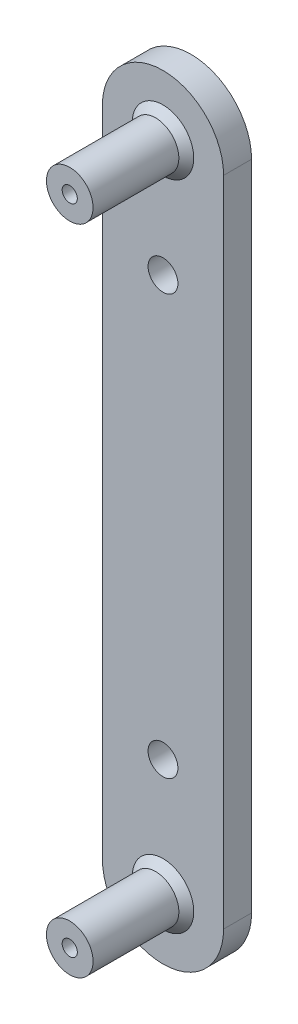
ISO-10303-21;
HEADER;
FILE_DESCRIPTION(('STEP AP214'),'2;1');
FILE_NAME('part.step','',(''),(''),'','','');
FILE_SCHEMA(('AUTOMOTIVE_DESIGN { 1 0 10303 214 1 1 1 1 }'));
ENDSEC;
DATA;
#1=APPLICATION_CONTEXT('core data for automotive mechanical design processes');
#2=APPLICATION_PROTOCOL_DEFINITION('international standard','automotive_design',2000,#1);
#3=PRODUCT_CONTEXT('',#1,'mechanical');
#4=PRODUCT('Part','Part','',(#3));
#5=PRODUCT_RELATED_PRODUCT_CATEGORY('part','',(#4));
#6=PRODUCT_DEFINITION_FORMATION('','',#4);
#7=PRODUCT_DEFINITION_CONTEXT('part definition',#1,'design');
#8=PRODUCT_DEFINITION('design','',#6,#7);
#9=PRODUCT_DEFINITION_SHAPE('','',#8);
#10=(LENGTH_UNIT() NAMED_UNIT(*) SI_UNIT(.MILLI.,.METRE.));
#11=(NAMED_UNIT(*) PLANE_ANGLE_UNIT() SI_UNIT($,.RADIAN.));
#12=(NAMED_UNIT(*) SI_UNIT($,.STERADIAN.) SOLID_ANGLE_UNIT());
#13=UNCERTAINTY_MEASURE_WITH_UNIT(LENGTH_MEASURE(1.E-05),#10,'distance_accuracy_value','');
#14=(GEOMETRIC_REPRESENTATION_CONTEXT(3) GLOBAL_UNCERTAINTY_ASSIGNED_CONTEXT((#13)) GLOBAL_UNIT_ASSIGNED_CONTEXT((#10,
#11,#12)) REPRESENTATION_CONTEXT('',''));
#15=CARTESIAN_POINT('',(0.,0.,0.));
#16=DIRECTION('',(0.,0.,1.));
#17=DIRECTION('',(1.,0.,0.));
#18=AXIS2_PLACEMENT_3D('',#15,#16,#17);
#19=CARTESIAN_POINT('',(0.,-35.,-3.));
#20=DIRECTION('',(0.,0.,-1.));
#21=DIRECTION('',(-1.,0.,0.));
#22=AXIS2_PLACEMENT_3D('',#19,#20,#21);
#23=PLANE('',#22);
#24=CARTESIAN_POINT('',(0.,-35.,-3.));
#25=DIRECTION('',(0.,0.,-1.));
#26=DIRECTION('',(-1.,0.,0.));
#27=AXIS2_PLACEMENT_3D('',#24,#25,#26);
#28=CIRCLE('',#27,6.49999999999998);
#29=CARTESIAN_POINT('',(6.49999999999998,-35.,-3.));
#30=VERTEX_POINT('',#29);
#31=CARTESIAN_POINT('',(-6.49999999999998,-35.,-3.));
#32=VERTEX_POINT('',#31);
#33=EDGE_CURVE('E98',#30,#32,#28,.T.);
#34=ORIENTED_EDGE('',*,*,#33,.T.);
#35=DIRECTION('',(0.,1.,0.));
#36=VECTOR('',#35,1.);
#37=CARTESIAN_POINT('',(-6.49999999999998,-35.,-3.));
#38=LINE('',#37,#36);
#39=CARTESIAN_POINT('',(-6.49999999999999,35.,-3.));
#40=VERTEX_POINT('',#39);
#41=EDGE_CURVE('E93',#32,#40,#38,.T.);
#42=ORIENTED_EDGE('',*,*,#41,.T.);
#43=CARTESIAN_POINT('',(0.,35.,-3.));
#44=DIRECTION('',(0.,0.,-1.));
#45=DIRECTION('',(-1.,0.,0.));
#46=AXIS2_PLACEMENT_3D('',#43,#44,#45);
#47=CIRCLE('',#46,6.49999999999998);
#48=CARTESIAN_POINT('',(6.49999999999999,35.,-3.));
#49=VERTEX_POINT('',#48);
#50=EDGE_CURVE('E96',#40,#49,#47,.T.);
#51=ORIENTED_EDGE('',*,*,#50,.T.);
#52=DIRECTION('',(0.,-1.,0.));
#53=VECTOR('',#52,1.);
#54=CARTESIAN_POINT('',(6.49999999999998,-35.,-3.));
#55=LINE('',#54,#53);
#56=EDGE_CURVE('E62',#49,#30,#55,.T.);
#57=ORIENTED_EDGE('',*,*,#56,.T.);
#58=EDGE_LOOP('',(#34,#42,#51,#57));
#59=FACE_BOUND('',#58,.T.);
#60=CARTESIAN_POINT('',(0.,35.,-3.));
#61=DIRECTION('',(0.,0.,-1.));
#62=DIRECTION('',(-1.,0.,0.));
#63=AXIS2_PLACEMENT_3D('',#60,#61,#62);
#64=CIRCLE('',#63,0.8125);
#65=CARTESIAN_POINT('',(-0.812500000000013,35.,-3.));
#66=VERTEX_POINT('',#65);
#67=EDGE_CURVE('E130',#66,#66,#64,.T.);
#68=ORIENTED_EDGE('',*,*,#67,.F.);
#69=EDGE_LOOP('',(#68));
#70=FACE_BOUND('',#69,.T.);
#71=CARTESIAN_POINT('',(0.,-35.,-3.));
#72=DIRECTION('',(0.,0.,-1.));
#73=DIRECTION('',(-1.,0.,0.));
#74=AXIS2_PLACEMENT_3D('',#71,#72,#73);
#75=CIRCLE('',#74,0.8125);
#76=CARTESIAN_POINT('',(-0.8125,-35.,-3.));
#77=VERTEX_POINT('',#76);
#78=EDGE_CURVE('E127',#77,#77,#75,.T.);
#79=ORIENTED_EDGE('',*,*,#78,.F.);
#80=EDGE_LOOP('',(#79));
#81=FACE_BOUND('',#80,.T.);
#82=CARTESIAN_POINT('',(0.,22.5,-3.));
#83=DIRECTION('',(0.,0.,-1.));
#84=DIRECTION('',(-1.,0.,0.));
#85=AXIS2_PLACEMENT_3D('',#82,#83,#84);
#86=CIRCLE('',#85,1.6);
#87=CARTESIAN_POINT('',(-1.6,22.5,-3.));
#88=VERTEX_POINT('',#87);
#89=EDGE_CURVE('E169',#88,#88,#86,.T.);
#90=ORIENTED_EDGE('',*,*,#89,.F.);
#91=EDGE_LOOP('',(#90));
#92=FACE_BOUND('',#91,.T.);
#93=CARTESIAN_POINT('',(0.,-22.5,-3.));
#94=DIRECTION('',(0.,0.,-1.));
#95=DIRECTION('',(-1.,0.,0.));
#96=AXIS2_PLACEMENT_3D('',#93,#94,#95);
#97=CIRCLE('',#96,1.6);
#98=CARTESIAN_POINT('',(-1.6,-22.5,-3.));
#99=VERTEX_POINT('',#98);
#100=EDGE_CURVE('E164',#99,#99,#97,.F.);
#101=ORIENTED_EDGE('',*,*,#100,.T.);
#102=EDGE_LOOP('',(#101));
#103=FACE_BOUND('',#102,.T.);
#104=ADVANCED_FACE('F44',(#59,#70,#81,#92,#103),#23,.T.);
#105=CARTESIAN_POINT('',(0.,-35.,0.));
#106=DIRECTION('',(0.,0.,-1.));
#107=DIRECTION('',(-1.,0.,0.));
#108=AXIS2_PLACEMENT_3D('',#105,#106,#107);
#109=PLANE('',#108);
#110=CARTESIAN_POINT('',(0.,22.5,0.));
#111=DIRECTION('',(0.,0.,1.));
#112=DIRECTION('',(1.,0.,0.));
#113=AXIS2_PLACEMENT_3D('',#110,#111,#112);
#114=CIRCLE('',#113,1.6);
#115=CARTESIAN_POINT('',(1.6,22.5,0.));
#116=VERTEX_POINT('',#115);
#117=EDGE_CURVE('E173',#116,#116,#114,.T.);
#118=ORIENTED_EDGE('',*,*,#117,.F.);
#119=EDGE_LOOP('',(#118));
#120=FACE_BOUND('',#119,.T.);
#121=CARTESIAN_POINT('',(0.,35.,0.));
#122=DIRECTION('',(0.,0.,-1.));
#123=DIRECTION('',(-1.,0.,0.));
#124=AXIS2_PLACEMENT_3D('',#121,#122,#123);
#125=CIRCLE('',#124,3.30000000000002);
#126=CARTESIAN_POINT('',(-3.30000000000003,35.,0.));
#127=VERTEX_POINT('',#126);
#128=EDGE_CURVE('E54',#127,#127,#125,.T.);
#129=ORIENTED_EDGE('',*,*,#128,.T.);
#130=EDGE_LOOP('',(#129));
#131=FACE_BOUND('',#130,.T.);
#132=CARTESIAN_POINT('',(0.,-35.,0.));
#133=DIRECTION('',(0.,0.,-1.));
#134=DIRECTION('',(-1.,0.,0.));
#135=AXIS2_PLACEMENT_3D('',#132,#133,#134);
#136=CIRCLE('',#135,3.30000000000002);
#137=CARTESIAN_POINT('',(-3.30000000000002,-35.,0.));
#138=VERTEX_POINT('',#137);
#139=EDGE_CURVE('E133',#138,#138,#136,.T.);
#140=ORIENTED_EDGE('',*,*,#139,.T.);
#141=EDGE_LOOP('',(#140));
#142=FACE_BOUND('',#141,.T.);
#143=CARTESIAN_POINT('',(0.,-35.,0.));
#144=DIRECTION('',(0.,0.,-1.));
#145=DIRECTION('',(-1.,0.,0.));
#146=AXIS2_PLACEMENT_3D('',#143,#144,#145);
#147=CIRCLE('',#146,6.49999999999998);
#148=CARTESIAN_POINT('',(6.49999999999998,-35.,0.));
#149=VERTEX_POINT('',#148);
#150=CARTESIAN_POINT('',(-6.49999999999998,-35.,0.));
#151=VERTEX_POINT('',#150);
#152=EDGE_CURVE('E113',#149,#151,#147,.T.);
#153=ORIENTED_EDGE('',*,*,#152,.F.);
#154=DIRECTION('',(0.,-1.,0.));
#155=VECTOR('',#154,1.);
#156=CARTESIAN_POINT('',(6.49999999999998,-35.,0.));
#157=LINE('',#156,#155);
#158=CARTESIAN_POINT('',(6.49999999999999,35.,0.));
#159=VERTEX_POINT('',#158);
#160=EDGE_CURVE('E85',#159,#149,#157,.T.);
#161=ORIENTED_EDGE('',*,*,#160,.F.);
#162=CARTESIAN_POINT('',(0.,35.,0.));
#163=DIRECTION('',(0.,0.,-1.));
#164=DIRECTION('',(-1.,0.,0.));
#165=AXIS2_PLACEMENT_3D('',#162,#163,#164);
#166=CIRCLE('',#165,6.49999999999998);
#167=CARTESIAN_POINT('',(-6.49999999999999,35.,0.));
#168=VERTEX_POINT('',#167);
#169=EDGE_CURVE('E79',#168,#159,#166,.T.);
#170=ORIENTED_EDGE('',*,*,#169,.F.);
#171=DIRECTION('',(0.,1.,0.));
#172=VECTOR('',#171,1.);
#173=CARTESIAN_POINT('',(-6.49999999999998,-35.,0.));
#174=LINE('',#173,#172);
#175=EDGE_CURVE('E103',#151,#168,#174,.T.);
#176=ORIENTED_EDGE('',*,*,#175,.F.);
#177=EDGE_LOOP('',(#153,#161,#170,#176));
#178=FACE_BOUND('',#177,.T.);
#179=CARTESIAN_POINT('',(0.,-22.5,0.));
#180=DIRECTION('',(0.,0.,-1.));
#181=DIRECTION('',(-1.,0.,0.));
#182=AXIS2_PLACEMENT_3D('',#179,#180,#181);
#183=CIRCLE('',#182,1.6);
#184=CARTESIAN_POINT('',(-1.6,-22.5,0.));
#185=VERTEX_POINT('',#184);
#186=EDGE_CURVE('E172',#185,#185,#183,.T.);
#187=ORIENTED_EDGE('',*,*,#186,.T.);
#188=EDGE_LOOP('',(#187));
#189=FACE_BOUND('',#188,.T.);
#190=ADVANCED_FACE('F138',(#120,#131,#142,#178,#189),#109,.F.);
#191=CARTESIAN_POINT('',(0.,-35.,10.));
#192=DIRECTION('',(0.,0.,-1.));
#193=DIRECTION('',(-1.,0.,0.));
#194=AXIS2_PLACEMENT_3D('',#191,#192,#193);
#195=CYLINDRICAL_SURFACE('',#194,2.5);
#196=CARTESIAN_POINT('',(0.,-35.,0.800000000000019));
#197=DIRECTION('',(0.,0.,-1.));
#198=DIRECTION('',(-1.,0.,0.));
#199=AXIS2_PLACEMENT_3D('',#196,#197,#198);
#200=CIRCLE('',#199,2.5);
#201=CARTESIAN_POINT('',(-2.5,-35.,0.800000000000019));
#202=VERTEX_POINT('',#201);
#203=EDGE_CURVE('E11',#202,#202,#200,.F.);
#204=ORIENTED_EDGE('',*,*,#203,.T.);
#205=EDGE_LOOP('',(#204));
#206=FACE_BOUND('',#205,.T.);
#207=CARTESIAN_POINT('',(0.,-35.,10.));
#208=DIRECTION('',(0.,0.,1.));
#209=DIRECTION('',(1.,0.,0.));
#210=AXIS2_PLACEMENT_3D('',#207,#208,#209);
#211=CIRCLE('',#210,2.5);
#212=CARTESIAN_POINT('',(2.5,-35.,10.));
#213=VERTEX_POINT('',#212);
#214=EDGE_CURVE('E123',#213,#213,#211,.T.);
#215=ORIENTED_EDGE('',*,*,#214,.F.);
#216=EDGE_LOOP('',(#215));
#217=FACE_BOUND('',#216,.T.);
#218=ADVANCED_FACE('F198',(#206,#217),#195,.T.);
#219=CARTESIAN_POINT('',(0.,0.,10.));
#220=DIRECTION('',(0.,0.,1.));
#221=DIRECTION('',(1.,0.,0.));
#222=AXIS2_PLACEMENT_3D('',#219,#220,#221);
#223=PLANE('',#222);
#224=CARTESIAN_POINT('',(0.,-35.,10.));
#225=DIRECTION('',(0.,0.,1.));
#226=DIRECTION('',(1.,0.,0.));
#227=AXIS2_PLACEMENT_3D('',#224,#225,#226);
#228=CIRCLE('',#227,0.8125);
#229=CARTESIAN_POINT('',(0.8125,-35.,10.));
#230=VERTEX_POINT('',#229);
#231=EDGE_CURVE('E160',#230,#230,#228,.T.);
#232=ORIENTED_EDGE('',*,*,#231,.F.);
#233=EDGE_LOOP('',(#232));
#234=FACE_BOUND('',#233,.T.);
#235=ORIENTED_EDGE('',*,*,#214,.T.);
#236=EDGE_LOOP('',(#235));
#237=FACE_BOUND('',#236,.T.);
#238=ADVANCED_FACE('F212',(#234,#237),#223,.T.);
#239=CARTESIAN_POINT('',(0.,-35.,-3.));
#240=DIRECTION('',(0.,0.,1.));
#241=DIRECTION('',(1.,0.,0.));
#242=AXIS2_PLACEMENT_3D('',#239,#240,#241);
#243=CYLINDRICAL_SURFACE('',#242,6.49999999999998);
#244=ORIENTED_EDGE('',*,*,#152,.T.);
#245=DIRECTION('',(0.,0.,1.));
#246=VECTOR('',#245,1.);
#247=CARTESIAN_POINT('',(-6.49999999999998,-35.,-3.));
#248=LINE('',#247,#246);
#249=EDGE_CURVE('E104',#32,#151,#248,.T.);
#250=ORIENTED_EDGE('',*,*,#249,.F.);
#251=ORIENTED_EDGE('',*,*,#33,.F.);
#252=DIRECTION('',(0.,0.,1.));
#253=VECTOR('',#252,1.);
#254=CARTESIAN_POINT('',(6.49999999999998,-35.,-3.));
#255=LINE('',#254,#253);
#256=EDGE_CURVE('E109',#30,#149,#255,.T.);
#257=ORIENTED_EDGE('',*,*,#256,.T.);
#258=EDGE_LOOP('',(#244,#250,#251,#257));
#259=FACE_BOUND('',#258,.T.);
#260=ADVANCED_FACE('F209',(#259),#243,.T.);
#261=CARTESIAN_POINT('',(-6.49999999999998,-35.,-3.));
#262=DIRECTION('',(1.,0.,0.));
#263=DIRECTION('',(0.,1.,0.));
#264=AXIS2_PLACEMENT_3D('',#261,#262,#263);
#265=PLANE('',#264);
#266=ORIENTED_EDGE('',*,*,#175,.T.);
#267=DIRECTION('',(0.,0.,1.));
#268=VECTOR('',#267,1.);
#269=CARTESIAN_POINT('',(-6.49999999999999,35.,-3.));
#270=LINE('',#269,#268);
#271=EDGE_CURVE('E101',#40,#168,#270,.T.);
#272=ORIENTED_EDGE('',*,*,#271,.F.);
#273=ORIENTED_EDGE('',*,*,#41,.F.);
#274=ORIENTED_EDGE('',*,*,#249,.T.);
#275=EDGE_LOOP('',(#266,#272,#273,#274));
#276=FACE_BOUND('',#275,.T.);
#277=ADVANCED_FACE('F102',(#276),#265,.F.);
#278=CARTESIAN_POINT('',(0.,35.,-3.));
#279=DIRECTION('',(0.,0.,1.));
#280=DIRECTION('',(1.,0.,0.));
#281=AXIS2_PLACEMENT_3D('',#278,#279,#280);
#282=CYLINDRICAL_SURFACE('',#281,6.49999999999998);
#283=ORIENTED_EDGE('',*,*,#169,.T.);
#284=DIRECTION('',(0.,0.,1.));
#285=VECTOR('',#284,1.);
#286=CARTESIAN_POINT('',(6.49999999999999,35.,-3.));
#287=LINE('',#286,#285);
#288=EDGE_CURVE('E105',#49,#159,#287,.T.);
#289=ORIENTED_EDGE('',*,*,#288,.F.);
#290=ORIENTED_EDGE('',*,*,#50,.F.);
#291=ORIENTED_EDGE('',*,*,#271,.T.);
#292=EDGE_LOOP('',(#283,#289,#290,#291));
#293=FACE_BOUND('',#292,.T.);
#294=ADVANCED_FACE('F107',(#293),#282,.T.);
#295=CARTESIAN_POINT('',(6.49999999999998,-35.,-3.));
#296=DIRECTION('',(-1.,0.,0.));
#297=DIRECTION('',(0.,-1.,0.));
#298=AXIS2_PLACEMENT_3D('',#295,#296,#297);
#299=PLANE('',#298);
#300=ORIENTED_EDGE('',*,*,#160,.T.);
#301=ORIENTED_EDGE('',*,*,#256,.F.);
#302=ORIENTED_EDGE('',*,*,#56,.F.);
#303=ORIENTED_EDGE('',*,*,#288,.T.);
#304=EDGE_LOOP('',(#300,#301,#302,#303));
#305=FACE_BOUND('',#304,.T.);
#306=ADVANCED_FACE('F151',(#305),#299,.F.);
#307=CARTESIAN_POINT('',(0.,35.,10.));
#308=DIRECTION('',(0.,0.,-1.));
#309=DIRECTION('',(-1.,0.,0.));
#310=AXIS2_PLACEMENT_3D('',#307,#308,#309);
#311=CYLINDRICAL_SURFACE('',#310,2.5);
#312=CARTESIAN_POINT('',(0.,35.,0.800000000000019));
#313=DIRECTION('',(0.,0.,-1.));
#314=DIRECTION('',(-1.,0.,0.));
#315=AXIS2_PLACEMENT_3D('',#312,#313,#314);
#316=CIRCLE('',#315,2.5);
#317=CARTESIAN_POINT('',(-2.50000000000001,35.,0.800000000000019));
#318=VERTEX_POINT('',#317);
#319=EDGE_CURVE('E126',#318,#318,#316,.F.);
#320=ORIENTED_EDGE('',*,*,#319,.T.);
#321=EDGE_LOOP('',(#320));
#322=FACE_BOUND('',#321,.T.);
#323=CARTESIAN_POINT('',(0.,35.,10.));
#324=DIRECTION('',(0.,0.,1.));
#325=DIRECTION('',(1.,0.,0.));
#326=AXIS2_PLACEMENT_3D('',#323,#324,#325);
#327=CIRCLE('',#326,2.5);
#328=CARTESIAN_POINT('',(2.49999999999999,35.,10.));
#329=VERTEX_POINT('',#328);
#330=EDGE_CURVE('E116',#329,#329,#327,.T.);
#331=ORIENTED_EDGE('',*,*,#330,.F.);
#332=EDGE_LOOP('',(#331));
#333=FACE_BOUND('',#332,.T.);
#334=ADVANCED_FACE('F147',(#322,#333),#311,.T.);
#335=CARTESIAN_POINT('',(0.,0.,10.));
#336=DIRECTION('',(0.,0.,1.));
#337=DIRECTION('',(1.,0.,0.));
#338=AXIS2_PLACEMENT_3D('',#335,#336,#337);
#339=PLANE('',#338);
#340=CARTESIAN_POINT('',(0.,35.,10.));
#341=DIRECTION('',(0.,0.,1.));
#342=DIRECTION('',(1.,0.,0.));
#343=AXIS2_PLACEMENT_3D('',#340,#341,#342);
#344=CIRCLE('',#343,0.8125);
#345=CARTESIAN_POINT('',(0.812499999999987,35.,10.));
#346=VERTEX_POINT('',#345);
#347=EDGE_CURVE('E161',#346,#346,#344,.T.);
#348=ORIENTED_EDGE('',*,*,#347,.F.);
#349=EDGE_LOOP('',(#348));
#350=FACE_BOUND('',#349,.T.);
#351=ORIENTED_EDGE('',*,*,#330,.T.);
#352=EDGE_LOOP('',(#351));
#353=FACE_BOUND('',#352,.T.);
#354=ADVANCED_FACE('F150',(#350,#353),#339,.T.);
#355=CARTESIAN_POINT('',(0.,35.,-8.));
#356=DIRECTION('',(0.,0.,1.));
#357=DIRECTION('',(1.,0.,0.));
#358=AXIS2_PLACEMENT_3D('',#355,#356,#357);
#359=CYLINDRICAL_SURFACE('',#358,0.8125);
#360=ORIENTED_EDGE('',*,*,#67,.T.);
#361=EDGE_LOOP('',(#360));
#362=FACE_BOUND('',#361,.T.);
#363=ORIENTED_EDGE('',*,*,#347,.T.);
#364=EDGE_LOOP('',(#363));
#365=FACE_BOUND('',#364,.T.);
#366=ADVANCED_FACE('F264',(#362,#365),#359,.F.);
#367=CARTESIAN_POINT('',(0.,-35.,-8.));
#368=DIRECTION('',(0.,0.,1.));
#369=DIRECTION('',(1.,0.,0.));
#370=AXIS2_PLACEMENT_3D('',#367,#368,#369);
#371=CYLINDRICAL_SURFACE('',#370,0.8125);
#372=ORIENTED_EDGE('',*,*,#78,.T.);
#373=EDGE_LOOP('',(#372));
#374=FACE_BOUND('',#373,.T.);
#375=ORIENTED_EDGE('',*,*,#231,.T.);
#376=EDGE_LOOP('',(#375));
#377=FACE_BOUND('',#376,.T.);
#378=ADVANCED_FACE('F144',(#374,#377),#371,.F.);
#379=CARTESIAN_POINT('',(0.,35.,0.800000000000019));
#380=DIRECTION('',(0.,0.,-1.));
#381=DIRECTION('',(-1.,0.,0.));
#382=AXIS2_PLACEMENT_3D('',#379,#380,#381);
#383=CONICAL_SURFACE('',#382,2.5,0.785398163397448);
#384=CARTESIAN_POINT('',(-3.30000000000003,35.,0.));
#385=CARTESIAN_POINT('',(-3.2916666666667,35.,0.00833333333333354));
#386=CARTESIAN_POINT('',(-3.28333333333336,35.,0.0166666666666671));
#387=CARTESIAN_POINT('',(-3.2666666666667,35.,0.0333333333333342));
#388=CARTESIAN_POINT('',(-3.25833333333336,35.,0.0416666666666678));
#389=CARTESIAN_POINT('',(-3.2416666666667,35.,0.0583333333333349));
#390=CARTESIAN_POINT('',(-3.23333333333336,35.,0.0666666666666684));
#391=CARTESIAN_POINT('',(-3.2166666666667,35.,0.0833333333333354));
#392=CARTESIAN_POINT('',(-3.20833333333336,35.,0.091666666666669));
#393=CARTESIAN_POINT('',(-3.1916666666667,35.,0.108333333333336));
#394=CARTESIAN_POINT('',(-3.18333333333336,35.,0.11666666666667));
#395=CARTESIAN_POINT('',(-3.16666666666669,35.,0.133333333333337));
#396=CARTESIAN_POINT('',(-3.15833333333336,35.,0.14166666666667));
#397=CARTESIAN_POINT('',(-3.14166666666669,35.,0.158333333333337));
#398=CARTESIAN_POINT('',(-3.13333333333336,35.,0.166666666666671));
#399=CARTESIAN_POINT('',(-3.11666666666669,35.,0.183333333333338));
#400=CARTESIAN_POINT('',(-3.10833333333336,35.,0.191666666666671));
#401=CARTESIAN_POINT('',(-3.09166666666669,35.,0.208333333333339));
#402=CARTESIAN_POINT('',(-3.08333333333336,35.,0.216666666666672));
#403=CARTESIAN_POINT('',(-3.06666666666669,35.,0.233333333333339));
#404=CARTESIAN_POINT('',(-3.05833333333336,35.,0.241666666666673));
#405=CARTESIAN_POINT('',(-3.04166666666669,35.,0.25833333333334));
#406=CARTESIAN_POINT('',(-3.03333333333336,35.,0.266666666666673));
#407=CARTESIAN_POINT('',(-3.01666666666669,35.,0.28333333333334));
#408=CARTESIAN_POINT('',(-3.00833333333336,35.,0.291666666666674));
#409=CARTESIAN_POINT('',(-2.99166666666669,35.,0.308333333333341));
#410=CARTESIAN_POINT('',(-2.98333333333336,35.,0.316666666666674));
#411=CARTESIAN_POINT('',(-2.96666666666669,35.,0.333333333333341));
#412=CARTESIAN_POINT('',(-2.95833333333336,35.,0.341666666666675));
#413=CARTESIAN_POINT('',(-2.94166666666669,35.,0.358333333333342));
#414=CARTESIAN_POINT('',(-2.93333333333336,35.,0.366666666666676));
#415=CARTESIAN_POINT('',(-2.91666666666669,35.,0.383333333333343));
#416=CARTESIAN_POINT('',(-2.90833333333336,35.,0.391666666666676));
#417=CARTESIAN_POINT('',(-2.89166666666669,35.,0.408333333333343));
#418=CARTESIAN_POINT('',(-2.88333333333336,35.,0.416666666666677));
#419=CARTESIAN_POINT('',(-2.86666666666669,35.,0.433333333333344));
#420=CARTESIAN_POINT('',(-2.85833333333335,35.,0.441666666666677));
#421=CARTESIAN_POINT('',(-2.84166666666669,35.,0.458333333333344));
#422=CARTESIAN_POINT('',(-2.83333333333335,35.,0.466666666666678));
#423=CARTESIAN_POINT('',(-2.81666666666669,35.,0.483333333333345));
#424=CARTESIAN_POINT('',(-2.80833333333335,35.,0.491666666666679));
#425=CARTESIAN_POINT('',(-2.79166666666669,35.,0.508333333333346));
#426=CARTESIAN_POINT('',(-2.78333333333335,35.,0.516666666666679));
#427=CARTESIAN_POINT('',(-2.76666666666669,35.,0.533333333333346));
#428=CARTESIAN_POINT('',(-2.75833333333335,35.,0.54166666666668));
#429=CARTESIAN_POINT('',(-2.74166666666669,35.,0.558333333333347));
#430=CARTESIAN_POINT('',(-2.73333333333335,35.,0.566666666666681));
#431=CARTESIAN_POINT('',(-2.71666666666668,35.,0.583333333333347));
#432=CARTESIAN_POINT('',(-2.70833333333335,35.,0.591666666666681));
#433=CARTESIAN_POINT('',(-2.69166666666668,35.,0.608333333333348));
#434=CARTESIAN_POINT('',(-2.68333333333335,35.,0.616666666666682));
#435=CARTESIAN_POINT('',(-2.66666666666668,35.,0.633333333333349));
#436=CARTESIAN_POINT('',(-2.65833333333335,35.,0.641666666666682));
#437=CARTESIAN_POINT('',(-2.64166666666668,35.,0.658333333333349));
#438=CARTESIAN_POINT('',(-2.63333333333335,35.,0.666666666666683));
#439=CARTESIAN_POINT('',(-2.61666666666668,35.,0.68333333333335));
#440=CARTESIAN_POINT('',(-2.60833333333335,35.,0.691666666666684));
#441=CARTESIAN_POINT('',(-2.59166666666668,35.,0.708333333333351));
#442=CARTESIAN_POINT('',(-2.58333333333335,35.,0.716666666666684));
#443=CARTESIAN_POINT('',(-2.56666666666668,35.,0.733333333333351));
#444=CARTESIAN_POINT('',(-2.55833333333335,35.,0.741666666666685));
#445=CARTESIAN_POINT('',(-2.54166666666668,35.,0.758333333333352));
#446=CARTESIAN_POINT('',(-2.53333333333335,35.,0.766666666666685));
#447=CARTESIAN_POINT('',(-2.51666666666668,35.,0.783333333333352));
#448=CARTESIAN_POINT('',(-2.50833333333335,35.,0.791666666666686));
#449=CARTESIAN_POINT('',(-2.50000000000001,35.,0.800000000000019));
#450=B_SPLINE_CURVE_WITH_KNOTS('',3,(#384,#385,#386,#387,#388,#389,#390,#391,#392,#393,#394,
#395,#396,#397,#398,#399,#400,#401,#402,#403,#404,#405,#406,#407,#408,#409,#410,#411,#412,#413,
#414,#415,#416,#417,#418,#419,#420,#421,#422,#423,#424,#425,#426,#427,#428,#429,#430,#431,#432,
#433,#434,#435,#436,#437,#438,#439,#440,#441,#442,#443,#444,#445,#446,#447,#448,#449),
.UNSPECIFIED.,.F.,.F.,(4,2,2,2,2,2,2,2,2,2,2,2,2,2,2,2,2,2,2,2,2,2,2,2,2,2,2,2,2,2,2,2,4),(0.,
0.0353553390593283,0.0707106781186563,0.106066017177985,0.141421356237313,0.176776695296641,
0.212132034355969,0.247487373415298,0.282842712474626,0.318198051533954,0.353553390593282,
0.38890872965261,0.424264068711938,0.459619407771267,0.494974746830595,0.530330085889923,
0.565685424949251,0.601040764008579,0.636396103067908,0.671751442127236,0.707106781186564,
0.742462120245892,0.77781745930522,0.813172798364549,0.848528137423877,0.883883476483205,
0.919238815542533,0.954594154601861,0.989949493661189,1.02530483272052,1.06066017177985,
1.09601551083917,1.1313708498985),.UNSPECIFIED.);
#451=EDGE_CURVE('BSEAM141',#127,#318,#450,.T.);
#452=ORIENTED_EDGE('',*,*,#128,.F.);
#453=ORIENTED_EDGE('',*,*,#319,.F.);
#454=ORIENTED_EDGE('',*,*,#451,.T.);
#455=ORIENTED_EDGE('',*,*,#451,.F.);
#456=EDGE_LOOP('',(#452,#454,#453,#455));
#457=FACE_BOUND('',#456,.T.);
#458=ADVANCED_FACE('F141',(#457),#383,.T.);
#459=CARTESIAN_POINT('',(0.,-35.,0.800000000000019));
#460=DIRECTION('',(0.,0.,-1.));
#461=DIRECTION('',(-1.,0.,0.));
#462=AXIS2_PLACEMENT_3D('',#459,#460,#461);
#463=CONICAL_SURFACE('',#462,2.5,0.785398163397448);
#464=CARTESIAN_POINT('',(-3.30000000000002,-35.,0.));
#465=CARTESIAN_POINT('',(-3.29166666666668,-35.,0.00833333333333354));
#466=CARTESIAN_POINT('',(-3.28333333333335,-35.,0.0166666666666671));
#467=CARTESIAN_POINT('',(-3.26666666666668,-35.,0.0333333333333342));
#468=CARTESIAN_POINT('',(-3.25833333333335,-35.,0.0416666666666678));
#469=CARTESIAN_POINT('',(-3.24166666666668,-35.,0.0583333333333349));
#470=CARTESIAN_POINT('',(-3.23333333333335,-35.,0.0666666666666684));
#471=CARTESIAN_POINT('',(-3.21666666666668,-35.,0.0833333333333354));
#472=CARTESIAN_POINT('',(-3.20833333333335,-35.,0.091666666666669));
#473=CARTESIAN_POINT('',(-3.19166666666668,-35.,0.108333333333336));
#474=CARTESIAN_POINT('',(-3.18333333333335,-35.,0.11666666666667));
#475=CARTESIAN_POINT('',(-3.16666666666668,-35.,0.133333333333337));
#476=CARTESIAN_POINT('',(-3.15833333333335,-35.,0.14166666666667));
#477=CARTESIAN_POINT('',(-3.14166666666668,-35.,0.158333333333337));
#478=CARTESIAN_POINT('',(-3.13333333333335,-35.,0.166666666666671));
#479=CARTESIAN_POINT('',(-3.11666666666668,-35.,0.183333333333338));
#480=CARTESIAN_POINT('',(-3.10833333333335,-35.,0.191666666666671));
#481=CARTESIAN_POINT('',(-3.09166666666668,-35.,0.208333333333339));
#482=CARTESIAN_POINT('',(-3.08333333333335,-35.,0.216666666666672));
#483=CARTESIAN_POINT('',(-3.06666666666668,-35.,0.233333333333339));
#484=CARTESIAN_POINT('',(-3.05833333333335,-35.,0.241666666666673));
#485=CARTESIAN_POINT('',(-3.04166666666668,-35.,0.25833333333334));
#486=CARTESIAN_POINT('',(-3.03333333333335,-35.,0.266666666666673));
#487=CARTESIAN_POINT('',(-3.01666666666668,-35.,0.28333333333334));
#488=CARTESIAN_POINT('',(-3.00833333333334,-35.,0.291666666666674));
#489=CARTESIAN_POINT('',(-2.99166666666668,-35.,0.308333333333341));
#490=CARTESIAN_POINT('',(-2.98333333333334,-35.,0.316666666666674));
#491=CARTESIAN_POINT('',(-2.96666666666668,-35.,0.333333333333341));
#492=CARTESIAN_POINT('',(-2.95833333333334,-35.,0.341666666666675));
#493=CARTESIAN_POINT('',(-2.94166666666668,-35.,0.358333333333342));
#494=CARTESIAN_POINT('',(-2.93333333333334,-35.,0.366666666666676));
#495=CARTESIAN_POINT('',(-2.91666666666668,-35.,0.383333333333343));
#496=CARTESIAN_POINT('',(-2.90833333333334,-35.,0.391666666666676));
#497=CARTESIAN_POINT('',(-2.89166666666668,-35.,0.408333333333343));
#498=CARTESIAN_POINT('',(-2.88333333333334,-35.,0.416666666666677));
#499=CARTESIAN_POINT('',(-2.86666666666667,-35.,0.433333333333344));
#500=CARTESIAN_POINT('',(-2.85833333333334,-35.,0.441666666666677));
#501=CARTESIAN_POINT('',(-2.84166666666667,-35.,0.458333333333344));
#502=CARTESIAN_POINT('',(-2.83333333333334,-35.,0.466666666666678));
#503=CARTESIAN_POINT('',(-2.81666666666667,-35.,0.483333333333345));
#504=CARTESIAN_POINT('',(-2.80833333333334,-35.,0.491666666666679));
#505=CARTESIAN_POINT('',(-2.79166666666667,-35.,0.508333333333346));
#506=CARTESIAN_POINT('',(-2.78333333333334,-35.,0.516666666666679));
#507=CARTESIAN_POINT('',(-2.76666666666667,-35.,0.533333333333346));
#508=CARTESIAN_POINT('',(-2.75833333333334,-35.,0.54166666666668));
#509=CARTESIAN_POINT('',(-2.74166666666667,-35.,0.558333333333347));
#510=CARTESIAN_POINT('',(-2.73333333333334,-35.,0.566666666666681));
#511=CARTESIAN_POINT('',(-2.71666666666667,-35.,0.583333333333347));
#512=CARTESIAN_POINT('',(-2.70833333333334,-35.,0.591666666666681));
#513=CARTESIAN_POINT('',(-2.69166666666667,-35.,0.608333333333348));
#514=CARTESIAN_POINT('',(-2.68333333333334,-35.,0.616666666666682));
#515=CARTESIAN_POINT('',(-2.66666666666667,-35.,0.633333333333349));
#516=CARTESIAN_POINT('',(-2.65833333333334,-35.,0.641666666666682));
#517=CARTESIAN_POINT('',(-2.64166666666667,-35.,0.658333333333349));
#518=CARTESIAN_POINT('',(-2.63333333333334,-35.,0.666666666666683));
#519=CARTESIAN_POINT('',(-2.61666666666667,-35.,0.68333333333335));
#520=CARTESIAN_POINT('',(-2.60833333333334,-35.,0.691666666666684));
#521=CARTESIAN_POINT('',(-2.59166666666667,-35.,0.708333333333351));
#522=CARTESIAN_POINT('',(-2.58333333333334,-35.,0.716666666666684));
#523=CARTESIAN_POINT('',(-2.56666666666667,-35.,0.733333333333351));
#524=CARTESIAN_POINT('',(-2.55833333333333,-35.,0.741666666666685));
#525=CARTESIAN_POINT('',(-2.54166666666667,-35.,0.758333333333352));
#526=CARTESIAN_POINT('',(-2.53333333333333,-35.,0.766666666666685));
#527=CARTESIAN_POINT('',(-2.51666666666667,-35.,0.783333333333352));
#528=CARTESIAN_POINT('',(-2.50833333333333,-35.,0.791666666666686));
#529=CARTESIAN_POINT('',(-2.5,-35.,0.800000000000019));
#530=B_SPLINE_CURVE_WITH_KNOTS('',3,(#464,#465,#466,#467,#468,#469,#470,#471,#472,#473,#474,
#475,#476,#477,#478,#479,#480,#481,#482,#483,#484,#485,#486,#487,#488,#489,#490,#491,#492,#493,
#494,#495,#496,#497,#498,#499,#500,#501,#502,#503,#504,#505,#506,#507,#508,#509,#510,#511,#512,
#513,#514,#515,#516,#517,#518,#519,#520,#521,#522,#523,#524,#525,#526,#527,#528,#529),
.UNSPECIFIED.,.F.,.F.,(4,2,2,2,2,2,2,2,2,2,2,2,2,2,2,2,2,2,2,2,2,2,2,2,2,2,2,2,2,2,2,2,4),(0.,
0.0353553390593283,0.0707106781186563,0.106066017177985,0.141421356237313,0.176776695296641,
0.212132034355969,0.247487373415298,0.282842712474626,0.318198051533954,0.353553390593282,
0.38890872965261,0.424264068711938,0.459619407771267,0.494974746830595,0.530330085889923,
0.565685424949251,0.601040764008579,0.636396103067908,0.671751442127236,0.707106781186564,
0.742462120245892,0.77781745930522,0.813172798364549,0.848528137423877,0.883883476483205,
0.919238815542533,0.954594154601861,0.989949493661189,1.02530483272052,1.06066017177985,
1.09601551083917,1.1313708498985),.UNSPECIFIED.);
#531=EDGE_CURVE('BSEAM47',#138,#202,#530,.T.);
#532=ORIENTED_EDGE('',*,*,#139,.F.);
#533=ORIENTED_EDGE('',*,*,#203,.F.);
#534=ORIENTED_EDGE('',*,*,#531,.T.);
#535=ORIENTED_EDGE('',*,*,#531,.F.);
#536=EDGE_LOOP('',(#532,#534,#533,#535));
#537=FACE_BOUND('',#536,.T.);
#538=ADVANCED_FACE('F47',(#537),#463,.T.);
#539=CARTESIAN_POINT('',(0.,22.5,-10.));
#540=DIRECTION('',(0.,0.,1.));
#541=DIRECTION('',(1.,0.,0.));
#542=AXIS2_PLACEMENT_3D('',#539,#540,#541);
#543=CYLINDRICAL_SURFACE('',#542,1.6);
#544=ORIENTED_EDGE('',*,*,#89,.T.);
#545=EDGE_LOOP('',(#544));
#546=FACE_BOUND('',#545,.T.);
#547=ORIENTED_EDGE('',*,*,#117,.T.);
#548=EDGE_LOOP('',(#547));
#549=FACE_BOUND('',#548,.T.);
#550=ADVANCED_FACE('F182',(#546,#549),#543,.F.);
#551=CARTESIAN_POINT('',(0.,-22.5,-10.));
#552=DIRECTION('',(0.,0.,1.));
#553=DIRECTION('',(1.,0.,0.));
#554=AXIS2_PLACEMENT_3D('',#551,#552,#553);
#555=CYLINDRICAL_SURFACE('',#554,1.6);
#556=ORIENTED_EDGE('',*,*,#100,.F.);
#557=EDGE_LOOP('',(#556));
#558=FACE_BOUND('',#557,.T.);
#559=ORIENTED_EDGE('',*,*,#186,.F.);
#560=EDGE_LOOP('',(#559));
#561=FACE_BOUND('',#560,.T.);
#562=ADVANCED_FACE('F180',(#558,#561),#555,.F.);
#563=CLOSED_SHELL('',(#104,#190,#218,#238,#260,#277,#294,#306,#334,#354,#366,#378,#458,#538,
#550,#562));
#564=MANIFOLD_SOLID_BREP('B2',#563);
#565=ADVANCED_BREP_SHAPE_REPRESENTATION('',(#18,#564),#14);
#566=SHAPE_DEFINITION_REPRESENTATION(#9,#565);
ENDSEC;
END-ISO-10303-21;
